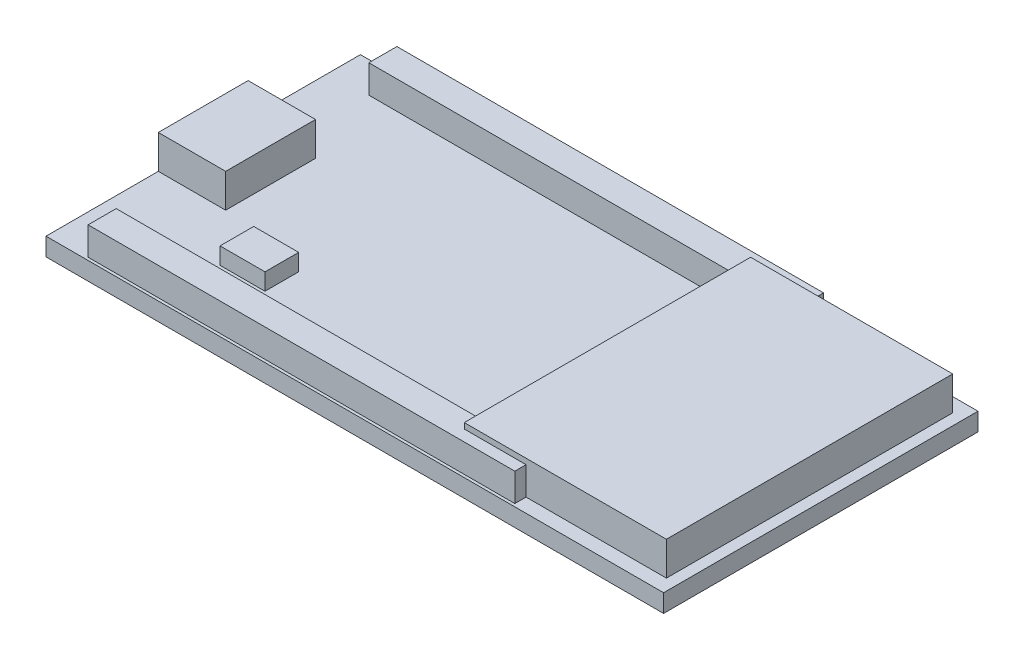
ISO-10303-21;
HEADER;
FILE_DESCRIPTION(('STEP AP214'),'2;1');
FILE_NAME('part.step','',(''),(''),'','','');
FILE_SCHEMA(('AUTOMOTIVE_DESIGN { 1 0 10303 214 1 1 1 1 }'));
ENDSEC;
DATA;
#1=APPLICATION_CONTEXT('core data for automotive mechanical design processes');
#2=APPLICATION_PROTOCOL_DEFINITION('international standard','automotive_design',2000,#1);
#3=PRODUCT_CONTEXT('',#1,'mechanical');
#4=PRODUCT('Part','Part','',(#3));
#5=PRODUCT_RELATED_PRODUCT_CATEGORY('part','',(#4));
#6=PRODUCT_DEFINITION_FORMATION('','',#4);
#7=PRODUCT_DEFINITION_CONTEXT('part definition',#1,'design');
#8=PRODUCT_DEFINITION('design','',#6,#7);
#9=PRODUCT_DEFINITION_SHAPE('','',#8);
#10=(LENGTH_UNIT() NAMED_UNIT(*) SI_UNIT(.MILLI.,.METRE.));
#11=(NAMED_UNIT(*) PLANE_ANGLE_UNIT() SI_UNIT($,.RADIAN.));
#12=(NAMED_UNIT(*) SI_UNIT($,.STERADIAN.) SOLID_ANGLE_UNIT());
#13=UNCERTAINTY_MEASURE_WITH_UNIT(LENGTH_MEASURE(1.E-05),#10,'distance_accuracy_value','');
#14=(GEOMETRIC_REPRESENTATION_CONTEXT(3) GLOBAL_UNCERTAINTY_ASSIGNED_CONTEXT((#13)) GLOBAL_UNIT_ASSIGNED_CONTEXT((#10,
#11,#12)) REPRESENTATION_CONTEXT('',''));
#15=CARTESIAN_POINT('',(0.,0.,0.));
#16=DIRECTION('',(0.,0.,1.));
#17=DIRECTION('',(1.,0.,0.));
#18=AXIS2_PLACEMENT_3D('',#15,#16,#17);
#19=CARTESIAN_POINT('',(0.,1.6,0.));
#20=DIRECTION('',(0.,-1.,0.));
#21=DIRECTION('',(0.,0.,-1.));
#22=AXIS2_PLACEMENT_3D('',#19,#20,#21);
#23=PLANE('',#22);
#24=DIRECTION('',(0.,0.,-1.));
#25=VECTOR('',#24,1.);
#26=CARTESIAN_POINT('',(14.,1.6,-11.25));
#27=LINE('',#26,#25);
#28=CARTESIAN_POINT('',(14.,1.6,-12.75));
#29=VERTEX_POINT('',#28);
#30=CARTESIAN_POINT('',(14.,1.6,-13.75));
#31=VERTEX_POINT('',#30);
#32=EDGE_CURVE('E250',#29,#31,#27,.T.);
#33=ORIENTED_EDGE('',*,*,#32,.F.);
#34=DIRECTION('',(-1.,0.,0.));
#35=VECTOR('',#34,1.);
#36=CARTESIAN_POINT('',(8.5,1.6,-12.75));
#37=LINE('',#36,#35);
#38=CARTESIAN_POINT('',(26.5,1.6,-12.75));
#39=VERTEX_POINT('',#38);
#40=EDGE_CURVE('E401',#39,#29,#37,.T.);
#41=ORIENTED_EDGE('',*,*,#40,.F.);
#42=DIRECTION('',(0.,0.,-1.));
#43=VECTOR('',#42,1.);
#44=CARTESIAN_POINT('',(26.5,1.6,12.75));
#45=LINE('',#44,#43);
#46=CARTESIAN_POINT('',(26.5,1.6,12.75));
#47=VERTEX_POINT('',#46);
#48=EDGE_CURVE('E383',#47,#39,#45,.T.);
#49=ORIENTED_EDGE('',*,*,#48,.F.);
#50=DIRECTION('',(1.,0.,0.));
#51=VECTOR('',#50,1.);
#52=CARTESIAN_POINT('',(8.5,1.6,12.75));
#53=LINE('',#52,#51);
#54=CARTESIAN_POINT('',(14.,1.6,12.75));
#55=VERTEX_POINT('',#54);
#56=EDGE_CURVE('E388',#55,#47,#53,.T.);
#57=ORIENTED_EDGE('',*,*,#56,.F.);
#58=DIRECTION('',(0.,0.,-1.));
#59=VECTOR('',#58,1.);
#60=CARTESIAN_POINT('',(14.,1.6,13.75));
#61=LINE('',#60,#59);
#62=CARTESIAN_POINT('',(14.,1.6,13.75));
#63=VERTEX_POINT('',#62);
#64=EDGE_CURVE('E299',#63,#55,#61,.T.);
#65=ORIENTED_EDGE('',*,*,#64,.F.);
#66=DIRECTION('',(1.,0.,0.));
#67=VECTOR('',#66,1.);
#68=CARTESIAN_POINT('',(-24.,1.6,13.75));
#69=LINE('',#68,#67);
#70=CARTESIAN_POINT('',(-24.,1.6,13.75));
#71=VERTEX_POINT('',#70);
#72=EDGE_CURVE('E303',#71,#63,#69,.T.);
#73=ORIENTED_EDGE('',*,*,#72,.F.);
#74=DIRECTION('',(0.,0.,1.));
#75=VECTOR('',#74,1.);
#76=CARTESIAN_POINT('',(-24.,1.6,13.75));
#77=LINE('',#76,#75);
#78=CARTESIAN_POINT('',(-24.,1.6,11.25));
#79=VERTEX_POINT('',#78);
#80=EDGE_CURVE('E321',#79,#71,#77,.T.);
#81=ORIENTED_EDGE('',*,*,#80,.F.);
#82=DIRECTION('',(-1.,0.,0.));
#83=VECTOR('',#82,1.);
#84=CARTESIAN_POINT('',(-24.,1.6,11.25));
#85=LINE('',#84,#83);
#86=CARTESIAN_POINT('',(8.5,1.6,11.25));
#87=VERTEX_POINT('',#86);
#88=EDGE_CURVE('E320',#87,#79,#85,.T.);
#89=ORIENTED_EDGE('',*,*,#88,.F.);
#90=DIRECTION('',(0.,0.,1.));
#91=VECTOR('',#90,1.);
#92=CARTESIAN_POINT('',(8.5,1.6,12.75));
#93=LINE('',#92,#91);
#94=CARTESIAN_POINT('',(8.5,1.6,-11.25));
#95=VERTEX_POINT('',#94);
#96=EDGE_CURVE('E407',#95,#87,#93,.T.);
#97=ORIENTED_EDGE('',*,*,#96,.F.);
#98=DIRECTION('',(1.,0.,0.));
#99=VECTOR('',#98,1.);
#100=CARTESIAN_POINT('',(-24.,1.6,-11.25));
#101=LINE('',#100,#99);
#102=CARTESIAN_POINT('',(-24.,1.6,-11.25));
#103=VERTEX_POINT('',#102);
#104=EDGE_CURVE('E265',#103,#95,#101,.T.);
#105=ORIENTED_EDGE('',*,*,#104,.F.);
#106=DIRECTION('',(0.,0.,1.));
#107=VECTOR('',#106,1.);
#108=CARTESIAN_POINT('',(-24.,1.6,-11.25));
#109=LINE('',#108,#107);
#110=CARTESIAN_POINT('',(-24.,1.6,-13.75));
#111=VERTEX_POINT('',#110);
#112=EDGE_CURVE('E277',#111,#103,#109,.T.);
#113=ORIENTED_EDGE('',*,*,#112,.F.);
#114=DIRECTION('',(-1.,0.,0.));
#115=VECTOR('',#114,1.);
#116=CARTESIAN_POINT('',(-24.,1.6,-13.75));
#117=LINE('',#116,#115);
#118=EDGE_CURVE('E252',#31,#111,#117,.T.);
#119=ORIENTED_EDGE('',*,*,#118,.F.);
#120=EDGE_LOOP('',(#33,#41,#49,#57,#65,#73,#81,#89,#97,#105,#113,#119));
#121=FACE_BOUND('',#120,.T.);
#122=DIRECTION('',(1.,0.,0.));
#123=VECTOR('',#122,1.);
#124=CARTESIAN_POINT('',(-27.5,1.6,4.));
#125=LINE('',#124,#123);
#126=CARTESIAN_POINT('',(-27.5,1.6,4.));
#127=VERTEX_POINT('',#126);
#128=CARTESIAN_POINT('',(-21.5,1.6,4.));
#129=VERTEX_POINT('',#128);
#130=EDGE_CURVE('E349',#127,#129,#125,.T.);
#131=ORIENTED_EDGE('',*,*,#130,.F.);
#132=DIRECTION('',(0.,0.,1.));
#133=VECTOR('',#132,1.);
#134=CARTESIAN_POINT('',(-27.5,1.6,14.));
#135=LINE('',#134,#133);
#136=CARTESIAN_POINT('',(-27.5,1.6,14.));
#137=VERTEX_POINT('',#136);
#138=EDGE_CURVE('E434',#127,#137,#135,.T.);
#139=ORIENTED_EDGE('',*,*,#138,.T.);
#140=DIRECTION('',(1.,0.,0.));
#141=VECTOR('',#140,1.);
#142=CARTESIAN_POINT('',(-27.5,1.6,14.));
#143=LINE('',#142,#141);
#144=CARTESIAN_POINT('',(27.5,1.6,14.));
#145=VERTEX_POINT('',#144);
#146=EDGE_CURVE('E438',#137,#145,#143,.T.);
#147=ORIENTED_EDGE('',*,*,#146,.T.);
#148=DIRECTION('',(0.,0.,-1.));
#149=VECTOR('',#148,1.);
#150=CARTESIAN_POINT('',(27.5,1.6,14.));
#151=LINE('',#150,#149);
#152=CARTESIAN_POINT('',(27.5,1.6,-14.));
#153=VERTEX_POINT('',#152);
#154=EDGE_CURVE('E430',#145,#153,#151,.T.);
#155=ORIENTED_EDGE('',*,*,#154,.T.);
#156=DIRECTION('',(-1.,0.,0.));
#157=VECTOR('',#156,1.);
#158=CARTESIAN_POINT('',(-27.5,1.6,-14.));
#159=LINE('',#158,#157);
#160=CARTESIAN_POINT('',(-27.5,1.6,-14.));
#161=VERTEX_POINT('',#160);
#162=EDGE_CURVE('E431',#153,#161,#159,.T.);
#163=ORIENTED_EDGE('',*,*,#162,.T.);
#164=CARTESIAN_POINT('',(-27.5,1.6,-4.));
#165=VERTEX_POINT('',#164);
#166=EDGE_CURVE('E436',#161,#165,#135,.T.);
#167=ORIENTED_EDGE('',*,*,#166,.T.);
#168=DIRECTION('',(-1.,0.,0.));
#169=VECTOR('',#168,1.);
#170=CARTESIAN_POINT('',(-27.5,1.6,-4.));
#171=LINE('',#170,#169);
#172=CARTESIAN_POINT('',(-21.5,1.6,-4.));
#173=VERTEX_POINT('',#172);
#174=EDGE_CURVE('E362',#173,#165,#171,.T.);
#175=ORIENTED_EDGE('',*,*,#174,.F.);
#176=DIRECTION('',(0.,0.,-1.));
#177=VECTOR('',#176,1.);
#178=CARTESIAN_POINT('',(-21.5,1.6,4.));
#179=LINE('',#178,#177);
#180=EDGE_CURVE('E342',#129,#173,#179,.T.);
#181=ORIENTED_EDGE('',*,*,#180,.F.);
#182=EDGE_LOOP('',(#131,#139,#147,#155,#163,#167,#175,#181));
#183=FACE_BOUND('',#182,.T.);
#184=DIRECTION('',(0.,0.,-1.));
#185=VECTOR('',#184,1.);
#186=CARTESIAN_POINT('',(-13.5,1.6,8.5));
#187=LINE('',#186,#185);
#188=CARTESIAN_POINT('',(-13.5,1.6,8.5));
#189=VERTEX_POINT('',#188);
#190=CARTESIAN_POINT('',(-13.5,1.6,5.5));
#191=VERTEX_POINT('',#190);
#192=EDGE_CURVE('E245',#189,#191,#187,.T.);
#193=ORIENTED_EDGE('',*,*,#192,.F.);
#194=DIRECTION('',(1.,0.,0.));
#195=VECTOR('',#194,1.);
#196=CARTESIAN_POINT('',(-17.5,1.6,8.5));
#197=LINE('',#196,#195);
#198=CARTESIAN_POINT('',(-17.5,1.6,8.5));
#199=VERTEX_POINT('',#198);
#200=EDGE_CURVE('E242',#199,#189,#197,.T.);
#201=ORIENTED_EDGE('',*,*,#200,.F.);
#202=DIRECTION('',(0.,0.,1.));
#203=VECTOR('',#202,1.);
#204=CARTESIAN_POINT('',(-17.5,1.6,8.5));
#205=LINE('',#204,#203);
#206=CARTESIAN_POINT('',(-17.5,1.6,5.5));
#207=VERTEX_POINT('',#206);
#208=EDGE_CURVE('E69',#207,#199,#205,.T.);
#209=ORIENTED_EDGE('',*,*,#208,.F.);
#210=DIRECTION('',(-1.,0.,0.));
#211=VECTOR('',#210,1.);
#212=CARTESIAN_POINT('',(-17.5,1.6,5.5));
#213=LINE('',#212,#211);
#214=EDGE_CURVE('E65',#191,#207,#213,.T.);
#215=ORIENTED_EDGE('',*,*,#214,.F.);
#216=EDGE_LOOP('',(#193,#201,#209,#215));
#217=FACE_BOUND('',#216,.T.);
#218=ADVANCED_FACE('F47',(#121,#183,#217),#23,.F.);
#219=CARTESIAN_POINT('',(8.5,4.6,12.75));
#220=DIRECTION('',(1.,0.,0.));
#221=DIRECTION('',(0.,0.,-1.));
#222=AXIS2_PLACEMENT_3D('',#219,#220,#221);
#223=PLANE('',#222);
#224=DIRECTION('',(0.,1.,0.));
#225=VECTOR('',#224,1.);
#226=CARTESIAN_POINT('',(8.5,4.6,-11.25));
#227=LINE('',#226,#225);
#228=CARTESIAN_POINT('',(8.5,4.1,-11.25));
#229=VERTEX_POINT('',#228);
#230=EDGE_CURVE('E11',#95,#229,#227,.T.);
#231=ORIENTED_EDGE('',*,*,#230,.F.);
#232=ORIENTED_EDGE('',*,*,#96,.T.);
#233=DIRECTION('',(0.,-1.,0.));
#234=VECTOR('',#233,1.);
#235=CARTESIAN_POINT('',(8.5,4.6,11.25));
#236=LINE('',#235,#234);
#237=CARTESIAN_POINT('',(8.5,4.1,11.25));
#238=VERTEX_POINT('',#237);
#239=EDGE_CURVE('E480',#238,#87,#236,.T.);
#240=ORIENTED_EDGE('',*,*,#239,.F.);
#241=DIRECTION('',(0.,0.,-1.));
#242=VECTOR('',#241,1.);
#243=CARTESIAN_POINT('',(8.5,4.1,12.75));
#244=LINE('',#243,#242);
#245=CARTESIAN_POINT('',(8.5,4.1,12.75));
#246=VERTEX_POINT('',#245);
#247=EDGE_CURVE('E338',#246,#238,#244,.T.);
#248=ORIENTED_EDGE('',*,*,#247,.F.);
#249=DIRECTION('',(0.,-1.,0.));
#250=VECTOR('',#249,1.);
#251=CARTESIAN_POINT('',(8.5,4.6,12.75));
#252=LINE('',#251,#250);
#253=CARTESIAN_POINT('',(8.5,4.6,12.75));
#254=VERTEX_POINT('',#253);
#255=EDGE_CURVE('E414',#254,#246,#252,.T.);
#256=ORIENTED_EDGE('',*,*,#255,.F.);
#257=DIRECTION('',(0.,0.,1.));
#258=VECTOR('',#257,1.);
#259=CARTESIAN_POINT('',(8.5,4.6,12.75));
#260=LINE('',#259,#258);
#261=CARTESIAN_POINT('',(8.5,4.6,-12.75));
#262=VERTEX_POINT('',#261);
#263=EDGE_CURVE('E394',#262,#254,#260,.T.);
#264=ORIENTED_EDGE('',*,*,#263,.F.);
#265=DIRECTION('',(0.,-1.,0.));
#266=VECTOR('',#265,1.);
#267=CARTESIAN_POINT('',(8.5,4.6,-12.75));
#268=LINE('',#267,#266);
#269=CARTESIAN_POINT('',(8.5,4.1,-12.75));
#270=VERTEX_POINT('',#269);
#271=EDGE_CURVE('E416',#262,#270,#268,.T.);
#272=ORIENTED_EDGE('',*,*,#271,.T.);
#273=DIRECTION('',(0.,0.,-1.));
#274=VECTOR('',#273,1.);
#275=CARTESIAN_POINT('',(8.5,4.1,12.75));
#276=LINE('',#275,#274);
#277=EDGE_CURVE('E294',#229,#270,#276,.T.);
#278=ORIENTED_EDGE('',*,*,#277,.F.);
#279=EDGE_LOOP('',(#231,#232,#240,#248,#256,#264,#272,#278));
#280=FACE_BOUND('',#279,.T.);
#281=ADVANCED_FACE('F499',(#280),#223,.F.);
#282=CARTESIAN_POINT('',(8.5,4.6,-12.75));
#283=DIRECTION('',(0.,0.,1.));
#284=DIRECTION('',(1.,0.,0.));
#285=AXIS2_PLACEMENT_3D('',#282,#283,#284);
#286=PLANE('',#285);
#287=DIRECTION('',(0.,-1.,0.));
#288=VECTOR('',#287,1.);
#289=CARTESIAN_POINT('',(14.,4.6,-12.75));
#290=LINE('',#289,#288);
#291=CARTESIAN_POINT('',(14.,4.1,-12.75));
#292=VERTEX_POINT('',#291);
#293=EDGE_CURVE('E59',#292,#29,#290,.T.);
#294=ORIENTED_EDGE('',*,*,#293,.F.);
#295=DIRECTION('',(1.,0.,0.));
#296=VECTOR('',#295,1.);
#297=CARTESIAN_POINT('',(8.5,4.1,-12.75));
#298=LINE('',#297,#296);
#299=EDGE_CURVE('E481',#270,#292,#298,.T.);
#300=ORIENTED_EDGE('',*,*,#299,.F.);
#301=ORIENTED_EDGE('',*,*,#271,.F.);
#302=DIRECTION('',(-1.,0.,0.));
#303=VECTOR('',#302,1.);
#304=CARTESIAN_POINT('',(8.5,4.6,-12.75));
#305=LINE('',#304,#303);
#306=CARTESIAN_POINT('',(26.5,4.6,-12.75));
#307=VERTEX_POINT('',#306);
#308=EDGE_CURVE('E386',#307,#262,#305,.T.);
#309=ORIENTED_EDGE('',*,*,#308,.F.);
#310=DIRECTION('',(0.,-1.,0.));
#311=VECTOR('',#310,1.);
#312=CARTESIAN_POINT('',(26.5,4.6,-12.75));
#313=LINE('',#312,#311);
#314=EDGE_CURVE('E425',#307,#39,#313,.T.);
#315=ORIENTED_EDGE('',*,*,#314,.T.);
#316=ORIENTED_EDGE('',*,*,#40,.T.);
#317=EDGE_LOOP('',(#294,#300,#301,#309,#315,#316));
#318=FACE_BOUND('',#317,.T.);
#319=ADVANCED_FACE('F491',(#318),#286,.F.);
#320=CARTESIAN_POINT('',(8.5,4.6,12.75));
#321=DIRECTION('',(0.,0.,-1.));
#322=DIRECTION('',(-1.,0.,0.));
#323=AXIS2_PLACEMENT_3D('',#320,#321,#322);
#324=PLANE('',#323);
#325=DIRECTION('',(0.,1.,0.));
#326=VECTOR('',#325,1.);
#327=CARTESIAN_POINT('',(14.,4.6,12.75));
#328=LINE('',#327,#326);
#329=CARTESIAN_POINT('',(14.,4.1,12.75));
#330=VERTEX_POINT('',#329);
#331=EDGE_CURVE('E471',#55,#330,#328,.T.);
#332=ORIENTED_EDGE('',*,*,#331,.F.);
#333=ORIENTED_EDGE('',*,*,#56,.T.);
#334=DIRECTION('',(0.,-1.,0.));
#335=VECTOR('',#334,1.);
#336=CARTESIAN_POINT('',(26.5,4.6,12.75));
#337=LINE('',#336,#335);
#338=CARTESIAN_POINT('',(26.5,4.6,12.75));
#339=VERTEX_POINT('',#338);
#340=EDGE_CURVE('E398',#339,#47,#337,.T.);
#341=ORIENTED_EDGE('',*,*,#340,.F.);
#342=DIRECTION('',(1.,0.,0.));
#343=VECTOR('',#342,1.);
#344=CARTESIAN_POINT('',(8.5,4.6,12.75));
#345=LINE('',#344,#343);
#346=EDGE_CURVE('E396',#254,#339,#345,.T.);
#347=ORIENTED_EDGE('',*,*,#346,.F.);
#348=ORIENTED_EDGE('',*,*,#255,.T.);
#349=DIRECTION('',(-1.,0.,0.));
#350=VECTOR('',#349,1.);
#351=CARTESIAN_POINT('',(8.5,4.1,12.75));
#352=LINE('',#351,#350);
#353=EDGE_CURVE('E468',#330,#246,#352,.T.);
#354=ORIENTED_EDGE('',*,*,#353,.F.);
#355=EDGE_LOOP('',(#332,#333,#341,#347,#348,#354));
#356=FACE_BOUND('',#355,.T.);
#357=ADVANCED_FACE('F525',(#356),#324,.F.);
#358=CARTESIAN_POINT('',(27.5,1.6,14.));
#359=DIRECTION('',(-1.,0.,0.));
#360=DIRECTION('',(0.,0.,1.));
#361=AXIS2_PLACEMENT_3D('',#358,#359,#360);
#362=PLANE('',#361);
#363=DIRECTION('',(0.,0.,-1.));
#364=VECTOR('',#363,1.);
#365=CARTESIAN_POINT('',(27.5,0.,14.));
#366=LINE('',#365,#364);
#367=CARTESIAN_POINT('',(27.5,0.,14.));
#368=VERTEX_POINT('',#367);
#369=CARTESIAN_POINT('',(27.5,0.,-14.));
#370=VERTEX_POINT('',#369);
#371=EDGE_CURVE('E426',#368,#370,#366,.T.);
#372=ORIENTED_EDGE('',*,*,#371,.T.);
#373=DIRECTION('',(0.,-1.,0.));
#374=VECTOR('',#373,1.);
#375=CARTESIAN_POINT('',(27.5,1.6,-14.));
#376=LINE('',#375,#374);
#377=EDGE_CURVE('E465',#153,#370,#376,.T.);
#378=ORIENTED_EDGE('',*,*,#377,.F.);
#379=ORIENTED_EDGE('',*,*,#154,.F.);
#380=DIRECTION('',(0.,-1.,0.));
#381=VECTOR('',#380,1.);
#382=CARTESIAN_POINT('',(27.5,1.6,14.));
#383=LINE('',#382,#381);
#384=EDGE_CURVE('E445',#145,#368,#383,.T.);
#385=ORIENTED_EDGE('',*,*,#384,.T.);
#386=EDGE_LOOP('',(#372,#378,#379,#385));
#387=FACE_BOUND('',#386,.T.);
#388=ADVANCED_FACE('F51',(#387),#362,.F.);
#389=CARTESIAN_POINT('',(-27.5,1.6,-14.));
#390=DIRECTION('',(0.,0.,1.));
#391=DIRECTION('',(1.,0.,0.));
#392=AXIS2_PLACEMENT_3D('',#389,#390,#391);
#393=PLANE('',#392);
#394=DIRECTION('',(-1.,0.,0.));
#395=VECTOR('',#394,1.);
#396=CARTESIAN_POINT('',(-27.5,0.,-14.));
#397=LINE('',#396,#395);
#398=CARTESIAN_POINT('',(-27.5,0.,-14.));
#399=VERTEX_POINT('',#398);
#400=EDGE_CURVE('E446',#370,#399,#397,.T.);
#401=ORIENTED_EDGE('',*,*,#400,.T.);
#402=DIRECTION('',(0.,-1.,0.));
#403=VECTOR('',#402,1.);
#404=CARTESIAN_POINT('',(-27.5,1.6,-14.));
#405=LINE('',#404,#403);
#406=EDGE_CURVE('E461',#161,#399,#405,.T.);
#407=ORIENTED_EDGE('',*,*,#406,.F.);
#408=ORIENTED_EDGE('',*,*,#162,.F.);
#409=ORIENTED_EDGE('',*,*,#377,.T.);
#410=EDGE_LOOP('',(#401,#407,#408,#409));
#411=FACE_BOUND('',#410,.T.);
#412=ADVANCED_FACE('F576',(#411),#393,.F.);
#413=CARTESIAN_POINT('',(-27.5,1.6,14.));
#414=DIRECTION('',(1.,0.,0.));
#415=DIRECTION('',(0.,0.,-1.));
#416=AXIS2_PLACEMENT_3D('',#413,#414,#415);
#417=PLANE('',#416);
#418=DIRECTION('',(0.,0.,1.));
#419=VECTOR('',#418,1.);
#420=CARTESIAN_POINT('',(-27.5,0.,14.));
#421=LINE('',#420,#419);
#422=CARTESIAN_POINT('',(-27.5,0.,14.));
#423=VERTEX_POINT('',#422);
#424=EDGE_CURVE('E448',#399,#423,#421,.T.);
#425=ORIENTED_EDGE('',*,*,#424,.T.);
#426=DIRECTION('',(0.,-1.,0.));
#427=VECTOR('',#426,1.);
#428=CARTESIAN_POINT('',(-27.5,1.6,14.));
#429=LINE('',#428,#427);
#430=EDGE_CURVE('E460',#137,#423,#429,.T.);
#431=ORIENTED_EDGE('',*,*,#430,.F.);
#432=ORIENTED_EDGE('',*,*,#138,.F.);
#433=DIRECTION('',(0.,-1.,0.));
#434=VECTOR('',#433,1.);
#435=CARTESIAN_POINT('',(-27.5,4.6,4.));
#436=LINE('',#435,#434);
#437=CARTESIAN_POINT('',(-27.5,4.6,4.));
#438=VERTEX_POINT('',#437);
#439=EDGE_CURVE('E375',#438,#127,#436,.T.);
#440=ORIENTED_EDGE('',*,*,#439,.F.);
#441=DIRECTION('',(0.,0.,1.));
#442=VECTOR('',#441,1.);
#443=CARTESIAN_POINT('',(-27.5,4.6,4.));
#444=LINE('',#443,#442);
#445=CARTESIAN_POINT('',(-27.5,4.6,-4.));
#446=VERTEX_POINT('',#445);
#447=EDGE_CURVE('E352',#446,#438,#444,.T.);
#448=ORIENTED_EDGE('',*,*,#447,.F.);
#449=DIRECTION('',(0.,-1.,0.));
#450=VECTOR('',#449,1.);
#451=CARTESIAN_POINT('',(-27.5,4.6,-4.));
#452=LINE('',#451,#450);
#453=EDGE_CURVE('E376',#446,#165,#452,.T.);
#454=ORIENTED_EDGE('',*,*,#453,.T.);
#455=ORIENTED_EDGE('',*,*,#166,.F.);
#456=ORIENTED_EDGE('',*,*,#406,.T.);
#457=EDGE_LOOP('',(#425,#431,#432,#440,#448,#454,#455,#456));
#458=FACE_BOUND('',#457,.T.);
#459=ADVANCED_FACE('F574',(#458),#417,.F.);
#460=CARTESIAN_POINT('',(-27.5,1.6,14.));
#461=DIRECTION('',(0.,0.,-1.));
#462=DIRECTION('',(-1.,0.,0.));
#463=AXIS2_PLACEMENT_3D('',#460,#461,#462);
#464=PLANE('',#463);
#465=DIRECTION('',(1.,0.,0.));
#466=VECTOR('',#465,1.);
#467=CARTESIAN_POINT('',(-27.5,0.,14.));
#468=LINE('',#467,#466);
#469=EDGE_CURVE('E435',#423,#368,#468,.T.);
#470=ORIENTED_EDGE('',*,*,#469,.T.);
#471=ORIENTED_EDGE('',*,*,#384,.F.);
#472=ORIENTED_EDGE('',*,*,#146,.F.);
#473=ORIENTED_EDGE('',*,*,#430,.T.);
#474=EDGE_LOOP('',(#470,#471,#472,#473));
#475=FACE_BOUND('',#474,.T.);
#476=ADVANCED_FACE('F569',(#475),#464,.F.);
#477=CARTESIAN_POINT('',(0.,0.,0.));
#478=DIRECTION('',(0.,-1.,0.));
#479=DIRECTION('',(0.,0.,-1.));
#480=AXIS2_PLACEMENT_3D('',#477,#478,#479);
#481=PLANE('',#480);
#482=ORIENTED_EDGE('',*,*,#371,.F.);
#483=ORIENTED_EDGE('',*,*,#469,.F.);
#484=ORIENTED_EDGE('',*,*,#424,.F.);
#485=ORIENTED_EDGE('',*,*,#400,.F.);
#486=EDGE_LOOP('',(#482,#483,#484,#485));
#487=FACE_BOUND('',#486,.T.);
#488=ADVANCED_FACE('F551',(#487),#481,.T.);
#489=CARTESIAN_POINT('',(26.5,4.6,12.75));
#490=DIRECTION('',(-1.,0.,0.));
#491=DIRECTION('',(0.,0.,1.));
#492=AXIS2_PLACEMENT_3D('',#489,#490,#491);
#493=PLANE('',#492);
#494=ORIENTED_EDGE('',*,*,#48,.T.);
#495=ORIENTED_EDGE('',*,*,#314,.F.);
#496=DIRECTION('',(0.,0.,-1.));
#497=VECTOR('',#496,1.);
#498=CARTESIAN_POINT('',(26.5,4.6,12.75));
#499=LINE('',#498,#497);
#500=EDGE_CURVE('E384',#339,#307,#499,.T.);
#501=ORIENTED_EDGE('',*,*,#500,.F.);
#502=ORIENTED_EDGE('',*,*,#340,.T.);
#503=EDGE_LOOP('',(#494,#495,#501,#502));
#504=FACE_BOUND('',#503,.T.);
#505=ADVANCED_FACE('F519',(#504),#493,.F.);
#506=CARTESIAN_POINT('',(0.,4.6,0.));
#507=DIRECTION('',(0.,-1.,0.));
#508=DIRECTION('',(0.,0.,-1.));
#509=AXIS2_PLACEMENT_3D('',#506,#507,#508);
#510=PLANE('',#509);
#511=ORIENTED_EDGE('',*,*,#500,.T.);
#512=ORIENTED_EDGE('',*,*,#308,.T.);
#513=ORIENTED_EDGE('',*,*,#263,.T.);
#514=ORIENTED_EDGE('',*,*,#346,.T.);
#515=EDGE_LOOP('',(#511,#512,#513,#514));
#516=FACE_BOUND('',#515,.T.);
#517=ADVANCED_FACE('F543',(#516),#510,.F.);
#518=CARTESIAN_POINT('',(-21.5,4.6,4.));
#519=DIRECTION('',(-1.,0.,0.));
#520=DIRECTION('',(0.,0.,1.));
#521=AXIS2_PLACEMENT_3D('',#518,#519,#520);
#522=PLANE('',#521);
#523=ORIENTED_EDGE('',*,*,#180,.T.);
#524=DIRECTION('',(0.,-1.,0.));
#525=VECTOR('',#524,1.);
#526=CARTESIAN_POINT('',(-21.5,4.6,-4.));
#527=LINE('',#526,#525);
#528=CARTESIAN_POINT('',(-21.5,4.6,-4.));
#529=VERTEX_POINT('',#528);
#530=EDGE_CURVE('E379',#529,#173,#527,.T.);
#531=ORIENTED_EDGE('',*,*,#530,.F.);
#532=DIRECTION('',(0.,0.,-1.));
#533=VECTOR('',#532,1.);
#534=CARTESIAN_POINT('',(-21.5,4.6,4.));
#535=LINE('',#534,#533);
#536=CARTESIAN_POINT('',(-21.5,4.6,4.));
#537=VERTEX_POINT('',#536);
#538=EDGE_CURVE('E343',#537,#529,#535,.T.);
#539=ORIENTED_EDGE('',*,*,#538,.F.);
#540=DIRECTION('',(0.,-1.,0.));
#541=VECTOR('',#540,1.);
#542=CARTESIAN_POINT('',(-21.5,4.6,4.));
#543=LINE('',#542,#541);
#544=EDGE_CURVE('E357',#537,#129,#543,.T.);
#545=ORIENTED_EDGE('',*,*,#544,.T.);
#546=EDGE_LOOP('',(#523,#531,#539,#545));
#547=FACE_BOUND('',#546,.T.);
#548=ADVANCED_FACE('F544',(#547),#522,.F.);
#549=CARTESIAN_POINT('',(-27.5,4.6,-4.));
#550=DIRECTION('',(0.,0.,1.));
#551=DIRECTION('',(1.,0.,0.));
#552=AXIS2_PLACEMENT_3D('',#549,#550,#551);
#553=PLANE('',#552);
#554=ORIENTED_EDGE('',*,*,#174,.T.);
#555=ORIENTED_EDGE('',*,*,#453,.F.);
#556=DIRECTION('',(-1.,0.,0.));
#557=VECTOR('',#556,1.);
#558=CARTESIAN_POINT('',(-27.5,4.6,-4.));
#559=LINE('',#558,#557);
#560=EDGE_CURVE('E346',#529,#446,#559,.T.);
#561=ORIENTED_EDGE('',*,*,#560,.F.);
#562=ORIENTED_EDGE('',*,*,#530,.T.);
#563=EDGE_LOOP('',(#554,#555,#561,#562));
#564=FACE_BOUND('',#563,.T.);
#565=ADVANCED_FACE('F552',(#564),#553,.F.);
#566=CARTESIAN_POINT('',(-27.5,4.6,4.));
#567=DIRECTION('',(0.,0.,-1.));
#568=DIRECTION('',(-1.,0.,0.));
#569=AXIS2_PLACEMENT_3D('',#566,#567,#568);
#570=PLANE('',#569);
#571=ORIENTED_EDGE('',*,*,#130,.T.);
#572=ORIENTED_EDGE('',*,*,#544,.F.);
#573=DIRECTION('',(1.,0.,0.));
#574=VECTOR('',#573,1.);
#575=CARTESIAN_POINT('',(-27.5,4.6,4.));
#576=LINE('',#575,#574);
#577=EDGE_CURVE('E355',#438,#537,#576,.T.);
#578=ORIENTED_EDGE('',*,*,#577,.F.);
#579=ORIENTED_EDGE('',*,*,#439,.T.);
#580=EDGE_LOOP('',(#571,#572,#578,#579));
#581=FACE_BOUND('',#580,.T.);
#582=ADVANCED_FACE('F599',(#581),#570,.F.);
#583=CARTESIAN_POINT('',(0.,4.6,0.));
#584=DIRECTION('',(0.,-1.,0.));
#585=DIRECTION('',(0.,0.,-1.));
#586=AXIS2_PLACEMENT_3D('',#583,#584,#585);
#587=PLANE('',#586);
#588=ORIENTED_EDGE('',*,*,#538,.T.);
#589=ORIENTED_EDGE('',*,*,#560,.T.);
#590=ORIENTED_EDGE('',*,*,#447,.T.);
#591=ORIENTED_EDGE('',*,*,#577,.T.);
#592=EDGE_LOOP('',(#588,#589,#590,#591));
#593=FACE_BOUND('',#592,.T.);
#594=ADVANCED_FACE('F603',(#593),#587,.F.);
#595=CARTESIAN_POINT('',(-24.,4.1,11.25));
#596=DIRECTION('',(0.,0.,1.));
#597=DIRECTION('',(1.,0.,0.));
#598=AXIS2_PLACEMENT_3D('',#595,#596,#597);
#599=PLANE('',#598);
#600=DIRECTION('',(-1.,0.,0.));
#601=VECTOR('',#600,1.);
#602=CARTESIAN_POINT('',(-24.,4.1,11.25));
#603=LINE('',#602,#601);
#604=CARTESIAN_POINT('',(-24.,4.1,11.25));
#605=VERTEX_POINT('',#604);
#606=EDGE_CURVE('E302',#238,#605,#603,.T.);
#607=ORIENTED_EDGE('',*,*,#606,.F.);
#608=ORIENTED_EDGE('',*,*,#239,.T.);
#609=ORIENTED_EDGE('',*,*,#88,.T.);
#610=DIRECTION('',(0.,-1.,0.));
#611=VECTOR('',#610,1.);
#612=CARTESIAN_POINT('',(-24.,4.1,11.25));
#613=LINE('',#612,#611);
#614=EDGE_CURVE('E333',#605,#79,#613,.T.);
#615=ORIENTED_EDGE('',*,*,#614,.F.);
#616=EDGE_LOOP('',(#607,#608,#609,#615));
#617=FACE_BOUND('',#616,.T.);
#618=ADVANCED_FACE('F540',(#617),#599,.F.);
#619=CARTESIAN_POINT('',(14.,4.1,13.75));
#620=DIRECTION('',(-1.,0.,0.));
#621=DIRECTION('',(0.,0.,1.));
#622=AXIS2_PLACEMENT_3D('',#619,#620,#621);
#623=PLANE('',#622);
#624=ORIENTED_EDGE('',*,*,#64,.T.);
#625=ORIENTED_EDGE('',*,*,#331,.T.);
#626=DIRECTION('',(0.,0.,-1.));
#627=VECTOR('',#626,1.);
#628=CARTESIAN_POINT('',(14.,4.1,13.75));
#629=LINE('',#628,#627);
#630=CARTESIAN_POINT('',(14.,4.1,13.75));
#631=VERTEX_POINT('',#630);
#632=EDGE_CURVE('E298',#631,#330,#629,.T.);
#633=ORIENTED_EDGE('',*,*,#632,.F.);
#634=DIRECTION('',(0.,-1.,0.));
#635=VECTOR('',#634,1.);
#636=CARTESIAN_POINT('',(14.,4.1,13.75));
#637=LINE('',#636,#635);
#638=EDGE_CURVE('E311',#631,#63,#637,.T.);
#639=ORIENTED_EDGE('',*,*,#638,.T.);
#640=EDGE_LOOP('',(#624,#625,#633,#639));
#641=FACE_BOUND('',#640,.T.);
#642=ADVANCED_FACE('F523',(#641),#623,.F.);
#643=CARTESIAN_POINT('',(0.,4.1,0.));
#644=DIRECTION('',(0.,-1.,0.));
#645=DIRECTION('',(0.,0.,-1.));
#646=AXIS2_PLACEMENT_3D('',#643,#644,#645);
#647=PLANE('',#646);
#648=ORIENTED_EDGE('',*,*,#353,.T.);
#649=ORIENTED_EDGE('',*,*,#247,.T.);
#650=ORIENTED_EDGE('',*,*,#606,.T.);
#651=DIRECTION('',(0.,0.,1.));
#652=VECTOR('',#651,1.);
#653=CARTESIAN_POINT('',(-24.,4.1,13.75));
#654=LINE('',#653,#652);
#655=CARTESIAN_POINT('',(-24.,4.1,13.75));
#656=VERTEX_POINT('',#655);
#657=EDGE_CURVE('E307',#605,#656,#654,.T.);
#658=ORIENTED_EDGE('',*,*,#657,.T.);
#659=DIRECTION('',(1.,0.,0.));
#660=VECTOR('',#659,1.);
#661=CARTESIAN_POINT('',(-24.,4.1,13.75));
#662=LINE('',#661,#660);
#663=EDGE_CURVE('E309',#656,#631,#662,.T.);
#664=ORIENTED_EDGE('',*,*,#663,.T.);
#665=ORIENTED_EDGE('',*,*,#632,.T.);
#666=EDGE_LOOP('',(#648,#649,#650,#658,#664,#665));
#667=FACE_BOUND('',#666,.T.);
#668=ADVANCED_FACE('F541',(#667),#647,.F.);
#669=CARTESIAN_POINT('',(-24.,4.1,13.75));
#670=DIRECTION('',(1.,0.,0.));
#671=DIRECTION('',(0.,0.,-1.));
#672=AXIS2_PLACEMENT_3D('',#669,#670,#671);
#673=PLANE('',#672);
#674=ORIENTED_EDGE('',*,*,#80,.T.);
#675=DIRECTION('',(0.,-1.,0.));
#676=VECTOR('',#675,1.);
#677=CARTESIAN_POINT('',(-24.,4.1,13.75));
#678=LINE('',#677,#676);
#679=EDGE_CURVE('E332',#656,#71,#678,.T.);
#680=ORIENTED_EDGE('',*,*,#679,.F.);
#681=ORIENTED_EDGE('',*,*,#657,.F.);
#682=ORIENTED_EDGE('',*,*,#614,.T.);
#683=EDGE_LOOP('',(#674,#680,#681,#682));
#684=FACE_BOUND('',#683,.T.);
#685=ADVANCED_FACE('F535',(#684),#673,.F.);
#686=CARTESIAN_POINT('',(-24.,4.1,13.75));
#687=DIRECTION('',(0.,0.,-1.));
#688=DIRECTION('',(-1.,0.,0.));
#689=AXIS2_PLACEMENT_3D('',#686,#687,#688);
#690=PLANE('',#689);
#691=ORIENTED_EDGE('',*,*,#72,.T.);
#692=ORIENTED_EDGE('',*,*,#638,.F.);
#693=ORIENTED_EDGE('',*,*,#663,.F.);
#694=ORIENTED_EDGE('',*,*,#679,.T.);
#695=EDGE_LOOP('',(#691,#692,#693,#694));
#696=FACE_BOUND('',#695,.T.);
#697=ADVANCED_FACE('F530',(#696),#690,.F.);
#698=CARTESIAN_POINT('',(-24.,4.1,-11.25));
#699=DIRECTION('',(0.,0.,-1.));
#700=DIRECTION('',(-1.,0.,0.));
#701=AXIS2_PLACEMENT_3D('',#698,#699,#700);
#702=PLANE('',#701);
#703=ORIENTED_EDGE('',*,*,#104,.T.);
#704=ORIENTED_EDGE('',*,*,#230,.T.);
#705=DIRECTION('',(1.,0.,0.));
#706=VECTOR('',#705,1.);
#707=CARTESIAN_POINT('',(-24.,4.1,-11.25));
#708=LINE('',#707,#706);
#709=CARTESIAN_POINT('',(-24.,4.1,-11.25));
#710=VERTEX_POINT('',#709);
#711=EDGE_CURVE('E268',#710,#229,#708,.T.);
#712=ORIENTED_EDGE('',*,*,#711,.F.);
#713=DIRECTION('',(0.,-1.,0.));
#714=VECTOR('',#713,1.);
#715=CARTESIAN_POINT('',(-24.,4.1,-11.25));
#716=LINE('',#715,#714);
#717=EDGE_CURVE('E271',#710,#103,#716,.T.);
#718=ORIENTED_EDGE('',*,*,#717,.T.);
#719=EDGE_LOOP('',(#703,#704,#712,#718));
#720=FACE_BOUND('',#719,.T.);
#721=ADVANCED_FACE('F502',(#720),#702,.F.);
#722=CARTESIAN_POINT('',(14.,4.1,-11.25));
#723=DIRECTION('',(-1.,0.,0.));
#724=DIRECTION('',(0.,0.,1.));
#725=AXIS2_PLACEMENT_3D('',#722,#723,#724);
#726=PLANE('',#725);
#727=DIRECTION('',(0.,0.,-1.));
#728=VECTOR('',#727,1.);
#729=CARTESIAN_POINT('',(14.,4.1,-11.25));
#730=LINE('',#729,#728);
#731=CARTESIAN_POINT('',(14.,4.1,-13.75));
#732=VERTEX_POINT('',#731);
#733=EDGE_CURVE('E256',#292,#732,#730,.T.);
#734=ORIENTED_EDGE('',*,*,#733,.F.);
#735=ORIENTED_EDGE('',*,*,#293,.T.);
#736=ORIENTED_EDGE('',*,*,#32,.T.);
#737=DIRECTION('',(0.,-1.,0.));
#738=VECTOR('',#737,1.);
#739=CARTESIAN_POINT('',(14.,4.1,-13.75));
#740=LINE('',#739,#738);
#741=EDGE_CURVE('E289',#732,#31,#740,.T.);
#742=ORIENTED_EDGE('',*,*,#741,.F.);
#743=EDGE_LOOP('',(#734,#735,#736,#742));
#744=FACE_BOUND('',#743,.T.);
#745=ADVANCED_FACE('F488',(#744),#726,.F.);
#746=CARTESIAN_POINT('',(0.,4.1,0.));
#747=DIRECTION('',(0.,-1.,0.));
#748=DIRECTION('',(0.,0.,-1.));
#749=AXIS2_PLACEMENT_3D('',#746,#747,#748);
#750=PLANE('',#749);
#751=ORIENTED_EDGE('',*,*,#711,.T.);
#752=ORIENTED_EDGE('',*,*,#277,.T.);
#753=ORIENTED_EDGE('',*,*,#299,.T.);
#754=ORIENTED_EDGE('',*,*,#733,.T.);
#755=DIRECTION('',(-1.,0.,0.));
#756=VECTOR('',#755,1.);
#757=CARTESIAN_POINT('',(-24.,4.1,-13.75));
#758=LINE('',#757,#756);
#759=CARTESIAN_POINT('',(-24.,4.1,-13.75));
#760=VERTEX_POINT('',#759);
#761=EDGE_CURVE('E261',#732,#760,#758,.T.);
#762=ORIENTED_EDGE('',*,*,#761,.T.);
#763=DIRECTION('',(0.,0.,1.));
#764=VECTOR('',#763,1.);
#765=CARTESIAN_POINT('',(-24.,4.1,-11.25));
#766=LINE('',#765,#764);
#767=EDGE_CURVE('E264',#760,#710,#766,.T.);
#768=ORIENTED_EDGE('',*,*,#767,.T.);
#769=EDGE_LOOP('',(#751,#752,#753,#754,#762,#768));
#770=FACE_BOUND('',#769,.T.);
#771=ADVANCED_FACE('F493',(#770),#750,.F.);
#772=CARTESIAN_POINT('',(-24.,4.1,-13.75));
#773=DIRECTION('',(0.,0.,1.));
#774=DIRECTION('',(1.,0.,0.));
#775=AXIS2_PLACEMENT_3D('',#772,#773,#774);
#776=PLANE('',#775);
#777=ORIENTED_EDGE('',*,*,#118,.T.);
#778=DIRECTION('',(0.,-1.,0.));
#779=VECTOR('',#778,1.);
#780=CARTESIAN_POINT('',(-24.,4.1,-13.75));
#781=LINE('',#780,#779);
#782=EDGE_CURVE('E286',#760,#111,#781,.T.);
#783=ORIENTED_EDGE('',*,*,#782,.F.);
#784=ORIENTED_EDGE('',*,*,#761,.F.);
#785=ORIENTED_EDGE('',*,*,#741,.T.);
#786=EDGE_LOOP('',(#777,#783,#784,#785));
#787=FACE_BOUND('',#786,.T.);
#788=ADVANCED_FACE('F515',(#787),#776,.F.);
#789=CARTESIAN_POINT('',(-24.,4.1,-11.25));
#790=DIRECTION('',(1.,0.,0.));
#791=DIRECTION('',(0.,0.,-1.));
#792=AXIS2_PLACEMENT_3D('',#789,#790,#791);
#793=PLANE('',#792);
#794=ORIENTED_EDGE('',*,*,#112,.T.);
#795=ORIENTED_EDGE('',*,*,#717,.F.);
#796=ORIENTED_EDGE('',*,*,#767,.F.);
#797=ORIENTED_EDGE('',*,*,#782,.T.);
#798=EDGE_LOOP('',(#794,#795,#796,#797));
#799=FACE_BOUND('',#798,.T.);
#800=ADVANCED_FACE('F507',(#799),#793,.F.);
#801=CARTESIAN_POINT('',(-13.5,3.1,8.5));
#802=DIRECTION('',(-1.,0.,0.));
#803=DIRECTION('',(0.,0.,1.));
#804=AXIS2_PLACEMENT_3D('',#801,#802,#803);
#805=PLANE('',#804);
#806=ORIENTED_EDGE('',*,*,#192,.T.);
#807=DIRECTION('',(0.,-1.,0.));
#808=VECTOR('',#807,1.);
#809=CARTESIAN_POINT('',(-13.5,3.1,5.5));
#810=LINE('',#809,#808);
#811=CARTESIAN_POINT('',(-13.5,3.1,5.5));
#812=VERTEX_POINT('',#811);
#813=EDGE_CURVE('E221',#812,#191,#810,.T.);
#814=ORIENTED_EDGE('',*,*,#813,.F.);
#815=DIRECTION('',(0.,0.,-1.));
#816=VECTOR('',#815,1.);
#817=CARTESIAN_POINT('',(-13.5,3.1,8.5));
#818=LINE('',#817,#816);
#819=CARTESIAN_POINT('',(-13.5,3.1,8.5));
#820=VERTEX_POINT('',#819);
#821=EDGE_CURVE('E235',#820,#812,#818,.T.);
#822=ORIENTED_EDGE('',*,*,#821,.F.);
#823=DIRECTION('',(0.,-1.,0.));
#824=VECTOR('',#823,1.);
#825=CARTESIAN_POINT('',(-13.5,3.1,8.5));
#826=LINE('',#825,#824);
#827=EDGE_CURVE('E923',#820,#189,#826,.T.);
#828=ORIENTED_EDGE('',*,*,#827,.T.);
#829=EDGE_LOOP('',(#806,#814,#822,#828));
#830=FACE_BOUND('',#829,.T.);
#831=ADVANCED_FACE('F243',(#830),#805,.F.);
#832=CARTESIAN_POINT('',(-17.5,3.1,5.5));
#833=DIRECTION('',(0.,0.,1.));
#834=DIRECTION('',(1.,0.,0.));
#835=AXIS2_PLACEMENT_3D('',#832,#833,#834);
#836=PLANE('',#835);
#837=ORIENTED_EDGE('',*,*,#214,.T.);
#838=DIRECTION('',(0.,-1.,0.));
#839=VECTOR('',#838,1.);
#840=CARTESIAN_POINT('',(-17.5,3.1,5.5));
#841=LINE('',#840,#839);
#842=CARTESIAN_POINT('',(-17.5,3.1,5.5));
#843=VERTEX_POINT('',#842);
#844=EDGE_CURVE('E227',#843,#207,#841,.T.);
#845=ORIENTED_EDGE('',*,*,#844,.F.);
#846=DIRECTION('',(-1.,0.,0.));
#847=VECTOR('',#846,1.);
#848=CARTESIAN_POINT('',(-17.5,3.1,5.5));
#849=LINE('',#848,#847);
#850=EDGE_CURVE('E219',#812,#843,#849,.T.);
#851=ORIENTED_EDGE('',*,*,#850,.F.);
#852=ORIENTED_EDGE('',*,*,#813,.T.);
#853=EDGE_LOOP('',(#837,#845,#851,#852));
#854=FACE_BOUND('',#853,.T.);
#855=ADVANCED_FACE('F225',(#854),#836,.F.);
#856=CARTESIAN_POINT('',(-17.5,3.1,8.5));
#857=DIRECTION('',(1.,0.,0.));
#858=DIRECTION('',(0.,0.,-1.));
#859=AXIS2_PLACEMENT_3D('',#856,#857,#858);
#860=PLANE('',#859);
#861=ORIENTED_EDGE('',*,*,#208,.T.);
#862=DIRECTION('',(0.,-1.,0.));
#863=VECTOR('',#862,1.);
#864=CARTESIAN_POINT('',(-17.5,3.1,8.5));
#865=LINE('',#864,#863);
#866=CARTESIAN_POINT('',(-17.5,3.1,8.5));
#867=VERTEX_POINT('',#866);
#868=EDGE_CURVE('E255',#867,#199,#865,.T.);
#869=ORIENTED_EDGE('',*,*,#868,.F.);
#870=DIRECTION('',(0.,0.,1.));
#871=VECTOR('',#870,1.);
#872=CARTESIAN_POINT('',(-17.5,3.1,8.5));
#873=LINE('',#872,#871);
#874=EDGE_CURVE('E231',#843,#867,#873,.T.);
#875=ORIENTED_EDGE('',*,*,#874,.F.);
#876=ORIENTED_EDGE('',*,*,#844,.T.);
#877=EDGE_LOOP('',(#861,#869,#875,#876));
#878=FACE_BOUND('',#877,.T.);
#879=ADVANCED_FACE('F643',(#878),#860,.F.);
#880=CARTESIAN_POINT('',(-17.5,3.1,8.5));
#881=DIRECTION('',(0.,0.,-1.));
#882=DIRECTION('',(-1.,0.,0.));
#883=AXIS2_PLACEMENT_3D('',#880,#881,#882);
#884=PLANE('',#883);
#885=ORIENTED_EDGE('',*,*,#200,.T.);
#886=ORIENTED_EDGE('',*,*,#827,.F.);
#887=DIRECTION('',(1.,0.,0.));
#888=VECTOR('',#887,1.);
#889=CARTESIAN_POINT('',(-17.5,3.1,8.5));
#890=LINE('',#889,#888);
#891=EDGE_CURVE('E240',#867,#820,#890,.T.);
#892=ORIENTED_EDGE('',*,*,#891,.F.);
#893=ORIENTED_EDGE('',*,*,#868,.T.);
#894=EDGE_LOOP('',(#885,#886,#892,#893));
#895=FACE_BOUND('',#894,.T.);
#896=ADVANCED_FACE('F644',(#895),#884,.F.);
#897=CARTESIAN_POINT('',(0.,3.1,0.));
#898=DIRECTION('',(0.,-1.,0.));
#899=DIRECTION('',(0.,0.,-1.));
#900=AXIS2_PLACEMENT_3D('',#897,#898,#899);
#901=PLANE('',#900);
#902=ORIENTED_EDGE('',*,*,#821,.T.);
#903=ORIENTED_EDGE('',*,*,#850,.T.);
#904=ORIENTED_EDGE('',*,*,#874,.T.);
#905=ORIENTED_EDGE('',*,*,#891,.T.);
#906=EDGE_LOOP('',(#902,#903,#904,#905));
#907=FACE_BOUND('',#906,.T.);
#908=ADVANCED_FACE('F234',(#907),#901,.F.);
#909=CLOSED_SHELL('',(#218,#281,#319,#357,#388,#412,#459,#476,#488,#505,#517,#548,#565,#582,
#594,#618,#642,#668,#685,#697,#721,#745,#771,#788,#800,#831,#855,#879,#896,#908));
#910=MANIFOLD_SOLID_BREP('B2',#909);
#911=ADVANCED_BREP_SHAPE_REPRESENTATION('',(#18,#910),#14);
#912=SHAPE_DEFINITION_REPRESENTATION(#9,#911);
ENDSEC;
END-ISO-10303-21;
